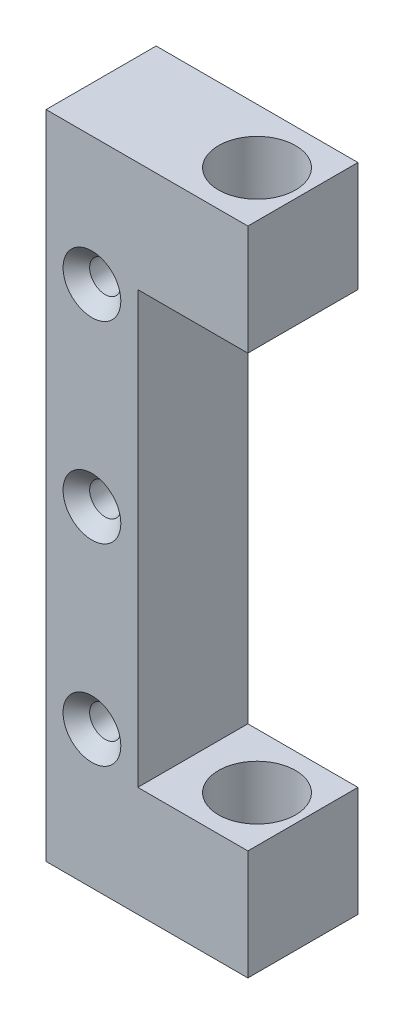
ISO-10303-21;
HEADER;
FILE_DESCRIPTION(('STEP AP214'),'2;1');
FILE_NAME('part.step','',(''),(''),'','','');
FILE_SCHEMA(('AUTOMOTIVE_DESIGN { 1 0 10303 214 1 1 1 1 }'));
ENDSEC;
DATA;
#1=APPLICATION_CONTEXT('core data for automotive mechanical design processes');
#2=APPLICATION_PROTOCOL_DEFINITION('international standard','automotive_design',2000,#1);
#3=PRODUCT_CONTEXT('',#1,'mechanical');
#4=PRODUCT('Part','Part','',(#3));
#5=PRODUCT_RELATED_PRODUCT_CATEGORY('part','',(#4));
#6=PRODUCT_DEFINITION_FORMATION('','',#4);
#7=PRODUCT_DEFINITION_CONTEXT('part definition',#1,'design');
#8=PRODUCT_DEFINITION('design','',#6,#7);
#9=PRODUCT_DEFINITION_SHAPE('','',#8);
#10=(LENGTH_UNIT() NAMED_UNIT(*) SI_UNIT(.MILLI.,.METRE.));
#11=(NAMED_UNIT(*) PLANE_ANGLE_UNIT() SI_UNIT($,.RADIAN.));
#12=(NAMED_UNIT(*) SI_UNIT($,.STERADIAN.) SOLID_ANGLE_UNIT());
#13=UNCERTAINTY_MEASURE_WITH_UNIT(LENGTH_MEASURE(1.E-05),#10,'distance_accuracy_value','');
#14=(GEOMETRIC_REPRESENTATION_CONTEXT(3) GLOBAL_UNCERTAINTY_ASSIGNED_CONTEXT((#13)) GLOBAL_UNIT_ASSIGNED_CONTEXT((#10,
#11,#12)) REPRESENTATION_CONTEXT('',''));
#15=CARTESIAN_POINT('',(0.,0.,0.));
#16=DIRECTION('',(0.,0.,1.));
#17=DIRECTION('',(1.,0.,0.));
#18=AXIS2_PLACEMENT_3D('',#15,#16,#17);
#19=CARTESIAN_POINT('',(0.,0.,12.));
#20=DIRECTION('',(0.,1.,0.));
#21=DIRECTION('',(0.,0.,1.));
#22=AXIS2_PLACEMENT_3D('',#19,#20,#21);
#23=PLANE('',#22);
#24=CARTESIAN_POINT('',(17.,0.,6.));
#25=DIRECTION('',(0.,1.,0.));
#26=DIRECTION('',(0.,0.,1.));
#27=AXIS2_PLACEMENT_3D('',#24,#25,#26);
#28=CIRCLE('',#27,4.19999999999999);
#29=CARTESIAN_POINT('',(17.,0.,10.2));
#30=VERTEX_POINT('',#29);
#31=EDGE_CURVE('E208',#30,#30,#28,.T.);
#32=ORIENTED_EDGE('',*,*,#31,.T.);
#33=EDGE_LOOP('',(#32));
#34=FACE_BOUND('',#33,.T.);
#35=DIRECTION('',(1.,0.,0.));
#36=VECTOR('',#35,1.);
#37=CARTESIAN_POINT('',(0.,0.,0.));
#38=LINE('',#37,#36);
#39=CARTESIAN_POINT('',(0.,0.,0.));
#40=VERTEX_POINT('',#39);
#41=CARTESIAN_POINT('',(22.,0.,0.));
#42=VERTEX_POINT('',#41);
#43=EDGE_CURVE('E128',#40,#42,#38,.T.);
#44=ORIENTED_EDGE('',*,*,#43,.T.);
#45=DIRECTION('',(0.,0.,-1.));
#46=VECTOR('',#45,1.);
#47=CARTESIAN_POINT('',(22.,0.,12.));
#48=LINE('',#47,#46);
#49=CARTESIAN_POINT('',(22.,0.,12.));
#50=VERTEX_POINT('',#49);
#51=EDGE_CURVE('E11',#50,#42,#48,.T.);
#52=ORIENTED_EDGE('',*,*,#51,.F.);
#53=DIRECTION('',(1.,0.,0.));
#54=VECTOR('',#53,1.);
#55=CARTESIAN_POINT('',(0.,0.,12.));
#56=LINE('',#55,#54);
#57=CARTESIAN_POINT('',(0.,0.,12.));
#58=VERTEX_POINT('',#57);
#59=EDGE_CURVE('E143',#58,#50,#56,.T.);
#60=ORIENTED_EDGE('',*,*,#59,.F.);
#61=DIRECTION('',(0.,0.,-1.));
#62=VECTOR('',#61,1.);
#63=CARTESIAN_POINT('',(0.,0.,12.));
#64=LINE('',#63,#62);
#65=EDGE_CURVE('E124',#58,#40,#64,.T.);
#66=ORIENTED_EDGE('',*,*,#65,.T.);
#67=EDGE_LOOP('',(#44,#52,#60,#66));
#68=FACE_BOUND('',#67,.T.);
#69=ADVANCED_FACE('F32',(#34,#68),#23,.F.);
#70=CARTESIAN_POINT('',(22.,0.,12.));
#71=DIRECTION('',(-1.,0.,0.));
#72=DIRECTION('',(0.,0.,1.));
#73=AXIS2_PLACEMENT_3D('',#70,#71,#72);
#74=PLANE('',#73);
#75=DIRECTION('',(0.,1.,0.));
#76=VECTOR('',#75,1.);
#77=CARTESIAN_POINT('',(22.,0.,0.));
#78=LINE('',#77,#76);
#79=CARTESIAN_POINT('',(22.,12.,0.));
#80=VERTEX_POINT('',#79);
#81=EDGE_CURVE('E131',#42,#80,#78,.T.);
#82=ORIENTED_EDGE('',*,*,#81,.T.);
#83=DIRECTION('',(0.,0.,-1.));
#84=VECTOR('',#83,1.);
#85=CARTESIAN_POINT('',(22.,12.,12.));
#86=LINE('',#85,#84);
#87=CARTESIAN_POINT('',(22.,12.,12.));
#88=VERTEX_POINT('',#87);
#89=EDGE_CURVE('E40',#88,#80,#86,.T.);
#90=ORIENTED_EDGE('',*,*,#89,.F.);
#91=DIRECTION('',(0.,1.,0.));
#92=VECTOR('',#91,1.);
#93=CARTESIAN_POINT('',(22.,0.,12.));
#94=LINE('',#93,#92);
#95=EDGE_CURVE('E91',#50,#88,#94,.T.);
#96=ORIENTED_EDGE('',*,*,#95,.F.);
#97=ORIENTED_EDGE('',*,*,#51,.T.);
#98=EDGE_LOOP('',(#82,#90,#96,#97));
#99=FACE_BOUND('',#98,.T.);
#100=ADVANCED_FACE('F228',(#99),#74,.F.);
#101=CARTESIAN_POINT('',(22.,12.,12.));
#102=DIRECTION('',(0.,-1.,0.));
#103=DIRECTION('',(1.,0.,0.));
#104=AXIS2_PLACEMENT_3D('',#101,#102,#103);
#105=PLANE('',#104);
#106=CARTESIAN_POINT('',(17.,12.,6.));
#107=DIRECTION('',(0.,-1.,0.));
#108=DIRECTION('',(1.,0.,0.));
#109=AXIS2_PLACEMENT_3D('',#106,#107,#108);
#110=CIRCLE('',#109,4.19999999999999);
#111=CARTESIAN_POINT('',(21.2,12.,6.));
#112=VERTEX_POINT('',#111);
#113=EDGE_CURVE('E205',#112,#112,#110,.T.);
#114=ORIENTED_EDGE('',*,*,#113,.T.);
#115=EDGE_LOOP('',(#114));
#116=FACE_BOUND('',#115,.T.);
#117=DIRECTION('',(-1.,0.,0.));
#118=VECTOR('',#117,1.);
#119=CARTESIAN_POINT('',(22.,12.,0.));
#120=LINE('',#119,#118);
#121=CARTESIAN_POINT('',(10.,12.,0.));
#122=VERTEX_POINT('',#121);
#123=EDGE_CURVE('E134',#80,#122,#120,.T.);
#124=ORIENTED_EDGE('',*,*,#123,.T.);
#125=DIRECTION('',(0.,0.,-1.));
#126=VECTOR('',#125,1.);
#127=CARTESIAN_POINT('',(10.,12.,12.));
#128=LINE('',#127,#126);
#129=CARTESIAN_POINT('',(10.,12.,12.));
#130=VERTEX_POINT('',#129);
#131=EDGE_CURVE('E150',#130,#122,#128,.T.);
#132=ORIENTED_EDGE('',*,*,#131,.F.);
#133=DIRECTION('',(-1.,0.,0.));
#134=VECTOR('',#133,1.);
#135=CARTESIAN_POINT('',(22.,12.,12.));
#136=LINE('',#135,#134);
#137=EDGE_CURVE('E158',#88,#130,#136,.T.);
#138=ORIENTED_EDGE('',*,*,#137,.F.);
#139=ORIENTED_EDGE('',*,*,#89,.T.);
#140=EDGE_LOOP('',(#124,#132,#138,#139));
#141=FACE_BOUND('',#140,.T.);
#142=ADVANCED_FACE('F156',(#116,#141),#105,.F.);
#143=CARTESIAN_POINT('',(10.,59.,12.));
#144=DIRECTION('',(-1.,0.,0.));
#145=DIRECTION('',(0.,0.,1.));
#146=AXIS2_PLACEMENT_3D('',#143,#144,#145);
#147=PLANE('',#146);
#148=DIRECTION('',(0.,1.,0.));
#149=VECTOR('',#148,1.);
#150=CARTESIAN_POINT('',(10.,59.,0.));
#151=LINE('',#150,#149);
#152=CARTESIAN_POINT('',(10.,59.,0.));
#153=VERTEX_POINT('',#152);
#154=EDGE_CURVE('E136',#122,#153,#151,.T.);
#155=ORIENTED_EDGE('',*,*,#154,.T.);
#156=DIRECTION('',(0.,0.,-1.));
#157=VECTOR('',#156,1.);
#158=CARTESIAN_POINT('',(10.,59.,12.));
#159=LINE('',#158,#157);
#160=CARTESIAN_POINT('',(10.,59.,12.));
#161=VERTEX_POINT('',#160);
#162=EDGE_CURVE('E147',#161,#153,#159,.T.);
#163=ORIENTED_EDGE('',*,*,#162,.F.);
#164=DIRECTION('',(0.,1.,0.));
#165=VECTOR('',#164,1.);
#166=CARTESIAN_POINT('',(10.,59.,12.));
#167=LINE('',#166,#165);
#168=EDGE_CURVE('E170',#130,#161,#167,.T.);
#169=ORIENTED_EDGE('',*,*,#168,.F.);
#170=ORIENTED_EDGE('',*,*,#131,.T.);
#171=EDGE_LOOP('',(#155,#163,#169,#170));
#172=FACE_BOUND('',#171,.T.);
#173=ADVANCED_FACE('F166',(#172),#147,.F.);
#174=CARTESIAN_POINT('',(22.,59.,12.));
#175=DIRECTION('',(0.,1.,0.));
#176=DIRECTION('',(-1.,0.,0.));
#177=AXIS2_PLACEMENT_3D('',#174,#175,#176);
#178=PLANE('',#177);
#179=CARTESIAN_POINT('',(17.,59.,6.));
#180=DIRECTION('',(0.,1.,0.));
#181=DIRECTION('',(-1.,0.,0.));
#182=AXIS2_PLACEMENT_3D('',#179,#180,#181);
#183=CIRCLE('',#182,4.19999999999999);
#184=CARTESIAN_POINT('',(12.8,59.,6.));
#185=VERTEX_POINT('',#184);
#186=EDGE_CURVE('E202',#185,#185,#183,.T.);
#187=ORIENTED_EDGE('',*,*,#186,.T.);
#188=EDGE_LOOP('',(#187));
#189=FACE_BOUND('',#188,.T.);
#190=DIRECTION('',(1.,0.,0.));
#191=VECTOR('',#190,1.);
#192=CARTESIAN_POINT('',(22.,59.,0.));
#193=LINE('',#192,#191);
#194=CARTESIAN_POINT('',(22.,59.,0.));
#195=VERTEX_POINT('',#194);
#196=EDGE_CURVE('E138',#153,#195,#193,.T.);
#197=ORIENTED_EDGE('',*,*,#196,.T.);
#198=DIRECTION('',(0.,0.,-1.));
#199=VECTOR('',#198,1.);
#200=CARTESIAN_POINT('',(22.,59.,12.));
#201=LINE('',#200,#199);
#202=CARTESIAN_POINT('',(22.,59.,12.));
#203=VERTEX_POINT('',#202);
#204=EDGE_CURVE('E119',#203,#195,#201,.T.);
#205=ORIENTED_EDGE('',*,*,#204,.F.);
#206=DIRECTION('',(1.,0.,0.));
#207=VECTOR('',#206,1.);
#208=CARTESIAN_POINT('',(22.,59.,12.));
#209=LINE('',#208,#207);
#210=EDGE_CURVE('E110',#161,#203,#209,.T.);
#211=ORIENTED_EDGE('',*,*,#210,.F.);
#212=ORIENTED_EDGE('',*,*,#162,.T.);
#213=EDGE_LOOP('',(#197,#205,#211,#212));
#214=FACE_BOUND('',#213,.T.);
#215=ADVANCED_FACE('F169',(#189,#214),#178,.F.);
#216=CARTESIAN_POINT('',(22.,71.,12.));
#217=DIRECTION('',(-1.,0.,0.));
#218=DIRECTION('',(0.,-1.,0.));
#219=AXIS2_PLACEMENT_3D('',#216,#217,#218);
#220=PLANE('',#219);
#221=DIRECTION('',(0.,1.,0.));
#222=VECTOR('',#221,1.);
#223=CARTESIAN_POINT('',(22.,71.,0.));
#224=LINE('',#223,#222);
#225=CARTESIAN_POINT('',(22.,71.,0.));
#226=VERTEX_POINT('',#225);
#227=EDGE_CURVE('E118',#195,#226,#224,.T.);
#228=ORIENTED_EDGE('',*,*,#227,.T.);
#229=DIRECTION('',(0.,0.,-1.));
#230=VECTOR('',#229,1.);
#231=CARTESIAN_POINT('',(22.,71.,12.));
#232=LINE('',#231,#230);
#233=CARTESIAN_POINT('',(22.,71.,12.));
#234=VERTEX_POINT('',#233);
#235=EDGE_CURVE('E115',#234,#226,#232,.T.);
#236=ORIENTED_EDGE('',*,*,#235,.F.);
#237=DIRECTION('',(0.,1.,0.));
#238=VECTOR('',#237,1.);
#239=CARTESIAN_POINT('',(22.,71.,12.));
#240=LINE('',#239,#238);
#241=EDGE_CURVE('E104',#203,#234,#240,.T.);
#242=ORIENTED_EDGE('',*,*,#241,.F.);
#243=ORIENTED_EDGE('',*,*,#204,.T.);
#244=EDGE_LOOP('',(#228,#236,#242,#243));
#245=FACE_BOUND('',#244,.T.);
#246=ADVANCED_FACE('F116',(#245),#220,.F.);
#247=CARTESIAN_POINT('',(0.,71.,12.));
#248=DIRECTION('',(0.,-1.,0.));
#249=DIRECTION('',(0.,0.,-1.));
#250=AXIS2_PLACEMENT_3D('',#247,#248,#249);
#251=PLANE('',#250);
#252=CARTESIAN_POINT('',(17.,71.,6.));
#253=DIRECTION('',(0.,1.,0.));
#254=DIRECTION('',(0.,0.,1.));
#255=AXIS2_PLACEMENT_3D('',#252,#253,#254);
#256=CIRCLE('',#255,4.19999999999999);
#257=CARTESIAN_POINT('',(17.,71.,10.2));
#258=VERTEX_POINT('',#257);
#259=EDGE_CURVE('E211',#258,#258,#256,.T.);
#260=ORIENTED_EDGE('',*,*,#259,.F.);
#261=EDGE_LOOP('',(#260));
#262=FACE_BOUND('',#261,.T.);
#263=DIRECTION('',(-1.,0.,0.));
#264=VECTOR('',#263,1.);
#265=CARTESIAN_POINT('',(0.,71.,0.));
#266=LINE('',#265,#264);
#267=CARTESIAN_POINT('',(0.,71.,0.));
#268=VERTEX_POINT('',#267);
#269=EDGE_CURVE('E77',#226,#268,#266,.T.);
#270=ORIENTED_EDGE('',*,*,#269,.T.);
#271=DIRECTION('',(0.,0.,-1.));
#272=VECTOR('',#271,1.);
#273=CARTESIAN_POINT('',(0.,71.,12.));
#274=LINE('',#273,#272);
#275=CARTESIAN_POINT('',(0.,71.,12.));
#276=VERTEX_POINT('',#275);
#277=EDGE_CURVE('E120',#276,#268,#274,.T.);
#278=ORIENTED_EDGE('',*,*,#277,.F.);
#279=DIRECTION('',(-1.,0.,0.));
#280=VECTOR('',#279,1.);
#281=CARTESIAN_POINT('',(0.,71.,12.));
#282=LINE('',#281,#280);
#283=EDGE_CURVE('E108',#234,#276,#282,.T.);
#284=ORIENTED_EDGE('',*,*,#283,.F.);
#285=ORIENTED_EDGE('',*,*,#235,.T.);
#286=EDGE_LOOP('',(#270,#278,#284,#285));
#287=FACE_BOUND('',#286,.T.);
#288=ADVANCED_FACE('F122',(#262,#287),#251,.F.);
#289=CARTESIAN_POINT('',(0.,0.,12.));
#290=DIRECTION('',(1.,0.,0.));
#291=DIRECTION('',(0.,0.,-1.));
#292=AXIS2_PLACEMENT_3D('',#289,#290,#291);
#293=PLANE('',#292);
#294=DIRECTION('',(0.,-1.,0.));
#295=VECTOR('',#294,1.);
#296=CARTESIAN_POINT('',(0.,0.,0.));
#297=LINE('',#296,#295);
#298=EDGE_CURVE('E83',#268,#40,#297,.T.);
#299=ORIENTED_EDGE('',*,*,#298,.T.);
#300=ORIENTED_EDGE('',*,*,#65,.F.);
#301=DIRECTION('',(0.,-1.,0.));
#302=VECTOR('',#301,1.);
#303=CARTESIAN_POINT('',(0.,0.,12.));
#304=LINE('',#303,#302);
#305=EDGE_CURVE('E48',#276,#58,#304,.T.);
#306=ORIENTED_EDGE('',*,*,#305,.F.);
#307=ORIENTED_EDGE('',*,*,#277,.T.);
#308=EDGE_LOOP('',(#299,#300,#306,#307));
#309=FACE_BOUND('',#308,.T.);
#310=ADVANCED_FACE('F219',(#309),#293,.F.);
#311=CARTESIAN_POINT('',(0.,0.,12.));
#312=DIRECTION('',(0.,0.,1.));
#313=DIRECTION('',(1.,0.,0.));
#314=AXIS2_PLACEMENT_3D('',#311,#312,#313);
#315=PLANE('',#314);
#316=CARTESIAN_POINT('',(5.,57.,12.));
#317=DIRECTION('',(0.,0.,1.));
#318=DIRECTION('',(1.,0.,0.));
#319=AXIS2_PLACEMENT_3D('',#316,#317,#318);
#320=CIRCLE('',#319,3.15);
#321=CARTESIAN_POINT('',(8.15,57.,12.));
#322=VERTEX_POINT('',#321);
#323=EDGE_CURVE('E199',#322,#322,#320,.T.);
#324=ORIENTED_EDGE('',*,*,#323,.F.);
#325=EDGE_LOOP('',(#324));
#326=FACE_BOUND('',#325,.T.);
#327=CARTESIAN_POINT('',(5.,36.,12.));
#328=DIRECTION('',(0.,0.,1.));
#329=DIRECTION('',(1.,0.,0.));
#330=AXIS2_PLACEMENT_3D('',#327,#328,#329);
#331=CIRCLE('',#330,3.15);
#332=CARTESIAN_POINT('',(8.15,36.,12.));
#333=VERTEX_POINT('',#332);
#334=EDGE_CURVE('E190',#333,#333,#331,.T.);
#335=ORIENTED_EDGE('',*,*,#334,.F.);
#336=EDGE_LOOP('',(#335));
#337=FACE_BOUND('',#336,.T.);
#338=CARTESIAN_POINT('',(5.,15.,12.));
#339=DIRECTION('',(0.,0.,1.));
#340=DIRECTION('',(1.,0.,0.));
#341=AXIS2_PLACEMENT_3D('',#338,#339,#340);
#342=CIRCLE('',#341,3.15);
#343=CARTESIAN_POINT('',(8.15,15.,12.));
#344=VERTEX_POINT('',#343);
#345=EDGE_CURVE('E181',#344,#344,#342,.T.);
#346=ORIENTED_EDGE('',*,*,#345,.F.);
#347=EDGE_LOOP('',(#346));
#348=FACE_BOUND('',#347,.T.);
#349=ORIENTED_EDGE('',*,*,#59,.T.);
#350=ORIENTED_EDGE('',*,*,#95,.T.);
#351=ORIENTED_EDGE('',*,*,#137,.T.);
#352=ORIENTED_EDGE('',*,*,#168,.T.);
#353=ORIENTED_EDGE('',*,*,#210,.T.);
#354=ORIENTED_EDGE('',*,*,#241,.T.);
#355=ORIENTED_EDGE('',*,*,#283,.T.);
#356=ORIENTED_EDGE('',*,*,#305,.T.);
#357=EDGE_LOOP('',(#349,#350,#351,#352,#353,#354,#355,#356));
#358=FACE_BOUND('',#357,.T.);
#359=ADVANCED_FACE('F106',(#326,#337,#348,#358),#315,.T.);
#360=CARTESIAN_POINT('',(0.,0.,0.));
#361=DIRECTION('',(0.,0.,1.));
#362=DIRECTION('',(1.,0.,0.));
#363=AXIS2_PLACEMENT_3D('',#360,#361,#362);
#364=PLANE('',#363);
#365=CARTESIAN_POINT('',(5.,57.,0.));
#366=DIRECTION('',(0.,0.,1.));
#367=DIRECTION('',(1.,0.,0.));
#368=AXIS2_PLACEMENT_3D('',#365,#366,#367);
#369=CIRCLE('',#368,1.7);
#370=CARTESIAN_POINT('',(6.7,57.,0.));
#371=VERTEX_POINT('',#370);
#372=EDGE_CURVE('E193',#371,#371,#369,.T.);
#373=ORIENTED_EDGE('',*,*,#372,.T.);
#374=EDGE_LOOP('',(#373));
#375=FACE_BOUND('',#374,.T.);
#376=CARTESIAN_POINT('',(5.,36.,0.));
#377=DIRECTION('',(0.,0.,1.));
#378=DIRECTION('',(1.,0.,0.));
#379=AXIS2_PLACEMENT_3D('',#376,#377,#378);
#380=CIRCLE('',#379,1.7);
#381=CARTESIAN_POINT('',(6.7,36.,0.));
#382=VERTEX_POINT('',#381);
#383=EDGE_CURVE('E184',#382,#382,#380,.T.);
#384=ORIENTED_EDGE('',*,*,#383,.T.);
#385=EDGE_LOOP('',(#384));
#386=FACE_BOUND('',#385,.T.);
#387=CARTESIAN_POINT('',(5.,15.,0.));
#388=DIRECTION('',(0.,0.,1.));
#389=DIRECTION('',(1.,0.,0.));
#390=AXIS2_PLACEMENT_3D('',#387,#388,#389);
#391=CIRCLE('',#390,1.7);
#392=CARTESIAN_POINT('',(6.7,15.,0.));
#393=VERTEX_POINT('',#392);
#394=EDGE_CURVE('E132',#393,#393,#391,.T.);
#395=ORIENTED_EDGE('',*,*,#394,.T.);
#396=EDGE_LOOP('',(#395));
#397=FACE_BOUND('',#396,.T.);
#398=ORIENTED_EDGE('',*,*,#43,.F.);
#399=ORIENTED_EDGE('',*,*,#298,.F.);
#400=ORIENTED_EDGE('',*,*,#269,.F.);
#401=ORIENTED_EDGE('',*,*,#227,.F.);
#402=ORIENTED_EDGE('',*,*,#196,.F.);
#403=ORIENTED_EDGE('',*,*,#154,.F.);
#404=ORIENTED_EDGE('',*,*,#123,.F.);
#405=ORIENTED_EDGE('',*,*,#81,.F.);
#406=EDGE_LOOP('',(#398,#399,#400,#401,#402,#403,#404,#405));
#407=FACE_BOUND('',#406,.T.);
#408=ADVANCED_FACE('F162',(#375,#386,#397,#407),#364,.F.);
#409=CARTESIAN_POINT('',(5.,15.,12.));
#410=DIRECTION('',(0.,0.,1.));
#411=DIRECTION('',(1.,0.,0.));
#412=AXIS2_PLACEMENT_3D('',#409,#410,#411);
#413=CYLINDRICAL_SURFACE('',#412,1.7);
#414=ORIENTED_EDGE('',*,*,#394,.F.);
#415=EDGE_LOOP('',(#414));
#416=FACE_BOUND('',#415,.T.);
#417=CARTESIAN_POINT('',(5.,15.,10.55));
#418=DIRECTION('',(0.,0.,1.));
#419=DIRECTION('',(1.,0.,0.));
#420=AXIS2_PLACEMENT_3D('',#417,#418,#419);
#421=CIRCLE('',#420,1.7);
#422=CARTESIAN_POINT('',(6.7,15.,10.55));
#423=VERTEX_POINT('',#422);
#424=EDGE_CURVE('E178',#423,#423,#421,.T.);
#425=ORIENTED_EDGE('',*,*,#424,.T.);
#426=EDGE_LOOP('',(#425));
#427=FACE_BOUND('',#426,.T.);
#428=ADVANCED_FACE('F279',(#416,#427),#413,.F.);
#429=CARTESIAN_POINT('',(5.,15.,12.));
#430=DIRECTION('',(0.,0.,1.));
#431=DIRECTION('',(1.,0.,0.));
#432=AXIS2_PLACEMENT_3D('',#429,#430,#431);
#433=CONICAL_SURFACE('',#432,3.15,0.785398163397448);
#434=ORIENTED_EDGE('',*,*,#424,.F.);
#435=EDGE_LOOP('',(#434));
#436=FACE_BOUND('',#435,.T.);
#437=ORIENTED_EDGE('',*,*,#345,.T.);
#438=EDGE_LOOP('',(#437));
#439=FACE_BOUND('',#438,.T.);
#440=ADVANCED_FACE('F275',(#436,#439),#433,.F.);
#441=CARTESIAN_POINT('',(5.,36.,12.));
#442=DIRECTION('',(0.,0.,1.));
#443=DIRECTION('',(1.,0.,0.));
#444=AXIS2_PLACEMENT_3D('',#441,#442,#443);
#445=CYLINDRICAL_SURFACE('',#444,1.7);
#446=ORIENTED_EDGE('',*,*,#383,.F.);
#447=EDGE_LOOP('',(#446));
#448=FACE_BOUND('',#447,.T.);
#449=CARTESIAN_POINT('',(5.,36.,10.55));
#450=DIRECTION('',(0.,0.,1.));
#451=DIRECTION('',(1.,0.,0.));
#452=AXIS2_PLACEMENT_3D('',#449,#450,#451);
#453=CIRCLE('',#452,1.7);
#454=CARTESIAN_POINT('',(6.7,36.,10.55));
#455=VERTEX_POINT('',#454);
#456=EDGE_CURVE('E187',#455,#455,#453,.T.);
#457=ORIENTED_EDGE('',*,*,#456,.T.);
#458=EDGE_LOOP('',(#457));
#459=FACE_BOUND('',#458,.T.);
#460=ADVANCED_FACE('F271',(#448,#459),#445,.F.);
#461=CARTESIAN_POINT('',(5.,36.,12.));
#462=DIRECTION('',(0.,0.,1.));
#463=DIRECTION('',(1.,0.,0.));
#464=AXIS2_PLACEMENT_3D('',#461,#462,#463);
#465=CONICAL_SURFACE('',#464,3.15,0.785398163397448);
#466=ORIENTED_EDGE('',*,*,#456,.F.);
#467=EDGE_LOOP('',(#466));
#468=FACE_BOUND('',#467,.T.);
#469=ORIENTED_EDGE('',*,*,#334,.T.);
#470=EDGE_LOOP('',(#469));
#471=FACE_BOUND('',#470,.T.);
#472=ADVANCED_FACE('F267',(#468,#471),#465,.F.);
#473=CARTESIAN_POINT('',(5.,57.,12.));
#474=DIRECTION('',(0.,0.,1.));
#475=DIRECTION('',(1.,0.,0.));
#476=AXIS2_PLACEMENT_3D('',#473,#474,#475);
#477=CYLINDRICAL_SURFACE('',#476,1.7);
#478=ORIENTED_EDGE('',*,*,#372,.F.);
#479=EDGE_LOOP('',(#478));
#480=FACE_BOUND('',#479,.T.);
#481=CARTESIAN_POINT('',(5.,57.,10.55));
#482=DIRECTION('',(0.,0.,1.));
#483=DIRECTION('',(1.,0.,0.));
#484=AXIS2_PLACEMENT_3D('',#481,#482,#483);
#485=CIRCLE('',#484,1.7);
#486=CARTESIAN_POINT('',(6.7,57.,10.55));
#487=VERTEX_POINT('',#486);
#488=EDGE_CURVE('E196',#487,#487,#485,.T.);
#489=ORIENTED_EDGE('',*,*,#488,.T.);
#490=EDGE_LOOP('',(#489));
#491=FACE_BOUND('',#490,.T.);
#492=ADVANCED_FACE('F261',(#480,#491),#477,.F.);
#493=CARTESIAN_POINT('',(5.,57.,12.));
#494=DIRECTION('',(0.,0.,1.));
#495=DIRECTION('',(1.,0.,0.));
#496=AXIS2_PLACEMENT_3D('',#493,#494,#495);
#497=CONICAL_SURFACE('',#496,3.15,0.785398163397448);
#498=ORIENTED_EDGE('',*,*,#488,.F.);
#499=EDGE_LOOP('',(#498));
#500=FACE_BOUND('',#499,.T.);
#501=ORIENTED_EDGE('',*,*,#323,.T.);
#502=EDGE_LOOP('',(#501));
#503=FACE_BOUND('',#502,.T.);
#504=ADVANCED_FACE('F257',(#500,#503),#497,.F.);
#505=CARTESIAN_POINT('',(17.,71.,6.));
#506=DIRECTION('',(0.,1.,0.));
#507=DIRECTION('',(0.,0.,1.));
#508=AXIS2_PLACEMENT_3D('',#505,#506,#507);
#509=CYLINDRICAL_SURFACE('',#508,4.19999999999999);
#510=ORIENTED_EDGE('',*,*,#259,.T.);
#511=EDGE_LOOP('',(#510));
#512=FACE_BOUND('',#511,.T.);
#513=ORIENTED_EDGE('',*,*,#186,.F.);
#514=EDGE_LOOP('',(#513));
#515=FACE_BOUND('',#514,.T.);
#516=ADVANCED_FACE('F215',(#512,#515),#509,.F.);
#517=ORIENTED_EDGE('',*,*,#31,.F.);
#518=EDGE_LOOP('',(#517));
#519=FACE_BOUND('',#518,.T.);
#520=ORIENTED_EDGE('',*,*,#113,.F.);
#521=EDGE_LOOP('',(#520));
#522=FACE_BOUND('',#521,.T.);
#523=ADVANCED_FACE('F238',(#519,#522),#509,.F.);
#524=CLOSED_SHELL('',(#69,#100,#142,#173,#215,#246,#288,#310,#359,#408,#428,#440,#460,#472,#492,
#504,#516,#523));
#525=MANIFOLD_SOLID_BREP('B2',#524);
#526=ADVANCED_BREP_SHAPE_REPRESENTATION('',(#18,#525),#14);
#527=SHAPE_DEFINITION_REPRESENTATION(#9,#526);
ENDSEC;
END-ISO-10303-21;
